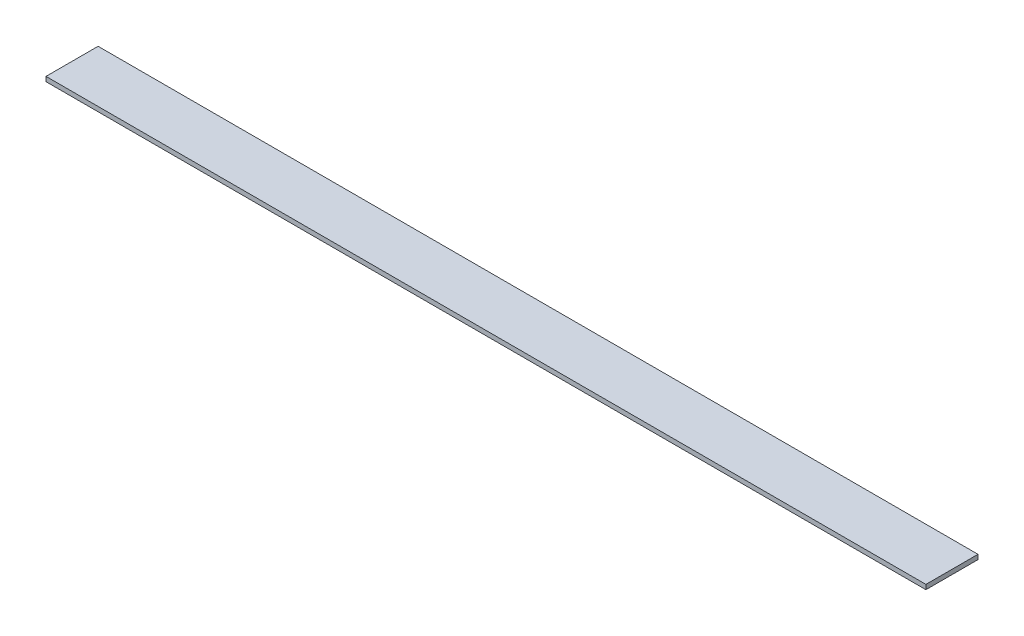
ISO-10303-21;
HEADER;
FILE_DESCRIPTION(('STEP AP214'),'2;1');
FILE_NAME('part.step','',(''),(''),'','','');
FILE_SCHEMA(('AUTOMOTIVE_DESIGN { 1 0 10303 214 1 1 1 1 }'));
ENDSEC;
DATA;
#1=APPLICATION_CONTEXT('core data for automotive mechanical design processes');
#2=APPLICATION_PROTOCOL_DEFINITION('international standard','automotive_design',2000,#1);
#3=PRODUCT_CONTEXT('',#1,'mechanical');
#4=PRODUCT('Part','Part','',(#3));
#5=PRODUCT_RELATED_PRODUCT_CATEGORY('part','',(#4));
#6=PRODUCT_DEFINITION_FORMATION('','',#4);
#7=PRODUCT_DEFINITION_CONTEXT('part definition',#1,'design');
#8=PRODUCT_DEFINITION('design','',#6,#7);
#9=PRODUCT_DEFINITION_SHAPE('','',#8);
#10=(LENGTH_UNIT() NAMED_UNIT(*) SI_UNIT(.MILLI.,.METRE.));
#11=(NAMED_UNIT(*) PLANE_ANGLE_UNIT() SI_UNIT($,.RADIAN.));
#12=(NAMED_UNIT(*) SI_UNIT($,.STERADIAN.) SOLID_ANGLE_UNIT());
#13=UNCERTAINTY_MEASURE_WITH_UNIT(LENGTH_MEASURE(1.E-05),#10,'distance_accuracy_value','');
#14=(GEOMETRIC_REPRESENTATION_CONTEXT(3) GLOBAL_UNCERTAINTY_ASSIGNED_CONTEXT((#13)) GLOBAL_UNIT_ASSIGNED_CONTEXT((#10,
#11,#12)) REPRESENTATION_CONTEXT('',''));
#15=CARTESIAN_POINT('',(0.,0.,0.));
#16=DIRECTION('',(0.,0.,1.));
#17=DIRECTION('',(1.,0.,0.));
#18=AXIS2_PLACEMENT_3D('',#15,#16,#17);
#19=CARTESIAN_POINT('',(1140.,-12.0000000000001,67.5000000000001));
#20=DIRECTION('',(1.,0.,0.));
#21=DIRECTION('',(0.,0.,-1.));
#22=AXIS2_PLACEMENT_3D('',#19,#20,#21);
#23=PLANE('',#22);
#24=DIRECTION('',(0.,0.,-1.));
#25=VECTOR('',#24,1.);
#26=CARTESIAN_POINT('',(1140.,0.,67.5000000000001));
#27=LINE('',#26,#25);
#28=CARTESIAN_POINT('',(1140.,0.,67.5000000000001));
#29=VERTEX_POINT('',#28);
#30=CARTESIAN_POINT('',(1140.,0.,-67.4999999999999));
#31=VERTEX_POINT('',#30);
#32=EDGE_CURVE('E110',#29,#31,#27,.T.);
#33=ORIENTED_EDGE('',*,*,#32,.F.);
#34=DIRECTION('',(0.,1.,0.));
#35=VECTOR('',#34,1.);
#36=CARTESIAN_POINT('',(1140.,-12.0000000000001,67.5000000000001));
#37=LINE('',#36,#35);
#38=CARTESIAN_POINT('',(1140.,-12.0000000000001,67.5000000000001));
#39=VERTEX_POINT('',#38);
#40=EDGE_CURVE('E11',#39,#29,#37,.T.);
#41=ORIENTED_EDGE('',*,*,#40,.F.);
#42=DIRECTION('',(0.,0.,-1.));
#43=VECTOR('',#42,1.);
#44=CARTESIAN_POINT('',(1140.,-12.0000000000001,67.5000000000001));
#45=LINE('',#44,#43);
#46=CARTESIAN_POINT('',(1140.,-12.,-67.5));
#47=VERTEX_POINT('',#46);
#48=EDGE_CURVE('E99',#39,#47,#45,.T.);
#49=ORIENTED_EDGE('',*,*,#48,.T.);
#50=DIRECTION('',(0.,1.,0.));
#51=VECTOR('',#50,1.);
#52=CARTESIAN_POINT('',(1140.,-12.,-67.5));
#53=LINE('',#52,#51);
#54=EDGE_CURVE('E40',#47,#31,#53,.T.);
#55=ORIENTED_EDGE('',*,*,#54,.T.);
#56=EDGE_LOOP('',(#33,#41,#49,#55));
#57=FACE_BOUND('',#56,.T.);
#58=ADVANCED_FACE('F37',(#57),#23,.T.);
#59=CARTESIAN_POINT('',(-1140.,-12.,67.5));
#60=DIRECTION('',(0.,0.,1.));
#61=DIRECTION('',(1.,0.,0.));
#62=AXIS2_PLACEMENT_3D('',#59,#60,#61);
#63=PLANE('',#62);
#64=DIRECTION('',(1.,0.,0.));
#65=VECTOR('',#64,1.);
#66=CARTESIAN_POINT('',(-1140.,0.,67.5000000000001));
#67=LINE('',#66,#65);
#68=CARTESIAN_POINT('',(-1140.,0.,67.5000000000001));
#69=VERTEX_POINT('',#68);
#70=EDGE_CURVE('E105',#69,#29,#67,.T.);
#71=ORIENTED_EDGE('',*,*,#70,.F.);
#72=DIRECTION('',(0.,1.,0.));
#73=VECTOR('',#72,1.);
#74=CARTESIAN_POINT('',(-1140.,-12.,67.5));
#75=LINE('',#74,#73);
#76=CARTESIAN_POINT('',(-1140.,-12.,67.5));
#77=VERTEX_POINT('',#76);
#78=EDGE_CURVE('E47',#77,#69,#75,.T.);
#79=ORIENTED_EDGE('',*,*,#78,.F.);
#80=DIRECTION('',(1.,0.,0.));
#81=VECTOR('',#80,1.);
#82=CARTESIAN_POINT('',(-1140.,-12.,67.5));
#83=LINE('',#82,#81);
#84=EDGE_CURVE('E94',#77,#39,#83,.T.);
#85=ORIENTED_EDGE('',*,*,#84,.T.);
#86=ORIENTED_EDGE('',*,*,#40,.T.);
#87=EDGE_LOOP('',(#71,#79,#85,#86));
#88=FACE_BOUND('',#87,.T.);
#89=ADVANCED_FACE('F134',(#88),#63,.T.);
#90=CARTESIAN_POINT('',(-1140.,-12.,67.5));
#91=DIRECTION('',(-1.,0.,0.));
#92=DIRECTION('',(0.,0.,1.));
#93=AXIS2_PLACEMENT_3D('',#90,#91,#92);
#94=PLANE('',#93);
#95=DIRECTION('',(0.,0.,1.));
#96=VECTOR('',#95,1.);
#97=CARTESIAN_POINT('',(-1140.,0.,67.5000000000001));
#98=LINE('',#97,#96);
#99=CARTESIAN_POINT('',(-1140.,0.,-67.4999999999999));
#100=VERTEX_POINT('',#99);
#101=EDGE_CURVE('E88',#100,#69,#98,.T.);
#102=ORIENTED_EDGE('',*,*,#101,.F.);
#103=DIRECTION('',(0.,1.,0.));
#104=VECTOR('',#103,1.);
#105=CARTESIAN_POINT('',(-1140.,-12.,-67.5));
#106=LINE('',#105,#104);
#107=CARTESIAN_POINT('',(-1140.,-12.,-67.5));
#108=VERTEX_POINT('',#107);
#109=EDGE_CURVE('E83',#108,#100,#106,.T.);
#110=ORIENTED_EDGE('',*,*,#109,.F.);
#111=DIRECTION('',(0.,0.,1.));
#112=VECTOR('',#111,1.);
#113=CARTESIAN_POINT('',(-1140.,-12.,67.5));
#114=LINE('',#113,#112);
#115=EDGE_CURVE('E86',#108,#77,#114,.T.);
#116=ORIENTED_EDGE('',*,*,#115,.T.);
#117=ORIENTED_EDGE('',*,*,#78,.T.);
#118=EDGE_LOOP('',(#102,#110,#116,#117));
#119=FACE_BOUND('',#118,.T.);
#120=ADVANCED_FACE('F85',(#119),#94,.T.);
#121=CARTESIAN_POINT('',(-1140.,-12.,-67.5));
#122=DIRECTION('',(0.,0.,-1.));
#123=DIRECTION('',(-1.,0.,0.));
#124=AXIS2_PLACEMENT_3D('',#121,#122,#123);
#125=PLANE('',#124);
#126=DIRECTION('',(-1.,0.,0.));
#127=VECTOR('',#126,1.);
#128=CARTESIAN_POINT('',(-1140.,0.,-67.4999999999999));
#129=LINE('',#128,#127);
#130=EDGE_CURVE('E114',#31,#100,#129,.T.);
#131=ORIENTED_EDGE('',*,*,#130,.F.);
#132=ORIENTED_EDGE('',*,*,#54,.F.);
#133=DIRECTION('',(-1.,0.,0.));
#134=VECTOR('',#133,1.);
#135=CARTESIAN_POINT('',(-1140.,-12.,-67.5));
#136=LINE('',#135,#134);
#137=EDGE_CURVE('E93',#47,#108,#136,.T.);
#138=ORIENTED_EDGE('',*,*,#137,.T.);
#139=ORIENTED_EDGE('',*,*,#109,.T.);
#140=EDGE_LOOP('',(#131,#132,#138,#139));
#141=FACE_BOUND('',#140,.T.);
#142=ADVANCED_FACE('F97',(#141),#125,.T.);
#143=CARTESIAN_POINT('',(0.,-12.0000000000001,0.));
#144=DIRECTION('',(0.,-1.,0.));
#145=DIRECTION('',(0.,0.,-1.));
#146=AXIS2_PLACEMENT_3D('',#143,#144,#145);
#147=PLANE('',#146);
#148=ORIENTED_EDGE('',*,*,#48,.F.);
#149=ORIENTED_EDGE('',*,*,#84,.F.);
#150=ORIENTED_EDGE('',*,*,#115,.F.);
#151=ORIENTED_EDGE('',*,*,#137,.F.);
#152=EDGE_LOOP('',(#148,#149,#150,#151));
#153=FACE_BOUND('',#152,.T.);
#154=ADVANCED_FACE('F92',(#153),#147,.T.);
#155=CARTESIAN_POINT('',(0.,0.,0.));
#156=DIRECTION('',(0.,-1.,0.));
#157=DIRECTION('',(0.,0.,-1.));
#158=AXIS2_PLACEMENT_3D('',#155,#156,#157);
#159=PLANE('',#158);
#160=ORIENTED_EDGE('',*,*,#32,.T.);
#161=ORIENTED_EDGE('',*,*,#130,.T.);
#162=ORIENTED_EDGE('',*,*,#101,.T.);
#163=ORIENTED_EDGE('',*,*,#70,.T.);
#164=EDGE_LOOP('',(#160,#161,#162,#163));
#165=FACE_BOUND('',#164,.T.);
#166=ADVANCED_FACE('F133',(#165),#159,.F.);
#167=CLOSED_SHELL('',(#58,#89,#120,#142,#154,#166));
#168=MANIFOLD_SOLID_BREP('B2',#167);
#169=ADVANCED_BREP_SHAPE_REPRESENTATION('',(#18,#168),#14);
#170=SHAPE_DEFINITION_REPRESENTATION(#9,#169);
ENDSEC;
END-ISO-10303-21;
